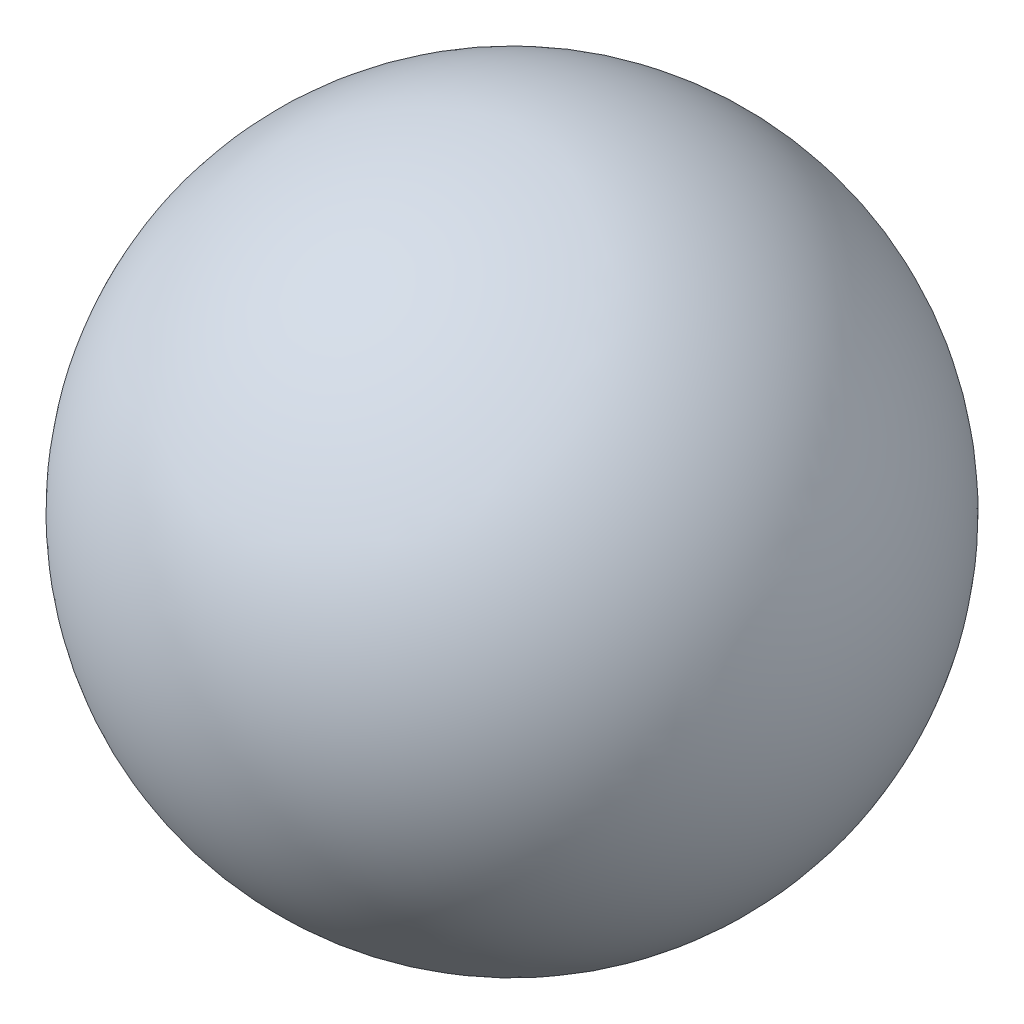
ISO-10303-21;
HEADER;
FILE_DESCRIPTION(('STEP AP214'),'2;1');
FILE_NAME('part.step','',(''),(''),'','','');
FILE_SCHEMA(('AUTOMOTIVE_DESIGN { 1 0 10303 214 1 1 1 1 }'));
ENDSEC;
DATA;
#1=APPLICATION_CONTEXT('core data for automotive mechanical design processes');
#2=APPLICATION_PROTOCOL_DEFINITION('international standard','automotive_design',2000,#1);
#3=PRODUCT_CONTEXT('',#1,'mechanical');
#4=PRODUCT('Part','Part','',(#3));
#5=PRODUCT_RELATED_PRODUCT_CATEGORY('part','',(#4));
#6=PRODUCT_DEFINITION_FORMATION('','',#4);
#7=PRODUCT_DEFINITION_CONTEXT('part definition',#1,'design');
#8=PRODUCT_DEFINITION('design','',#6,#7);
#9=PRODUCT_DEFINITION_SHAPE('','',#8);
#10=(LENGTH_UNIT() NAMED_UNIT(*) SI_UNIT(.MILLI.,.METRE.));
#11=(NAMED_UNIT(*) PLANE_ANGLE_UNIT() SI_UNIT($,.RADIAN.));
#12=(NAMED_UNIT(*) SI_UNIT($,.STERADIAN.) SOLID_ANGLE_UNIT());
#13=UNCERTAINTY_MEASURE_WITH_UNIT(LENGTH_MEASURE(1.E-05),#10,'distance_accuracy_value','');
#14=(GEOMETRIC_REPRESENTATION_CONTEXT(3) GLOBAL_UNCERTAINTY_ASSIGNED_CONTEXT((#13)) GLOBAL_UNIT_ASSIGNED_CONTEXT((#10,
#11,#12)) REPRESENTATION_CONTEXT('',''));
#15=CARTESIAN_POINT('',(0.,0.,0.));
#16=DIRECTION('',(0.,0.,1.));
#17=DIRECTION('',(1.,0.,0.));
#18=AXIS2_PLACEMENT_3D('',#15,#16,#17);
#19=CARTESIAN_POINT('',(0.,0.,0.));
#20=DIRECTION('',(-1.,0.,0.));
#21=DIRECTION('',(0.,0.,-1.));
#22=AXIS2_PLACEMENT_3D('',#19,#20,#21);
#23=SPHERICAL_SURFACE('',#22,20.);
#24=CARTESIAN_POINT('',(-20.,0.,0.));
#25=VERTEX_POINT('',#24);
#26=VERTEX_LOOP('',#25);
#27=FACE_BOUND('',#26,.T.);
#28=ADVANCED_FACE('F42',(#27),#23,.T.);
#29=CLOSED_SHELL('',(#28));
#30=CARTESIAN_POINT('',(0.,0.,0.));
#31=DIRECTION('',(1.,0.,0.));
#32=DIRECTION('',(0.,0.,1.));
#33=AXIS2_PLACEMENT_3D('',#30,#31,#32);
#34=SPHERICAL_SURFACE('',#33,19.6);
#35=CARTESIAN_POINT('',(19.6,0.,0.));
#36=VERTEX_POINT('',#35);
#37=VERTEX_LOOP('',#36);
#38=FACE_BOUND('',#37,.T.);
#39=ADVANCED_FACE('F54',(#38),#34,.F.);
#40=CLOSED_SHELL('',(#39));
#41=ORIENTED_CLOSED_SHELL('',*,#40,.T.);
#42=BREP_WITH_VOIDS('B2',#29,(#41));
#43=ADVANCED_BREP_SHAPE_REPRESENTATION('',(#18,#42),#14);
#44=SHAPE_DEFINITION_REPRESENTATION(#9,#43);
ENDSEC;
END-ISO-10303-21;
